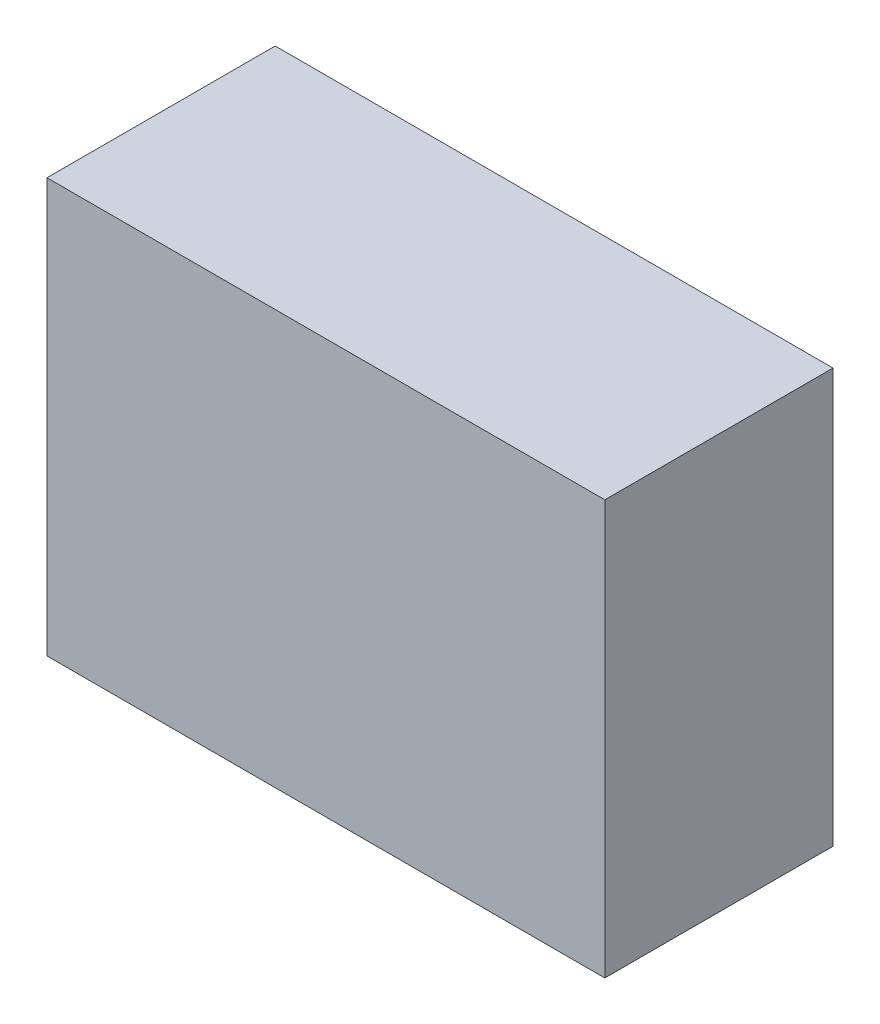
ISO-10303-21;
HEADER;
FILE_DESCRIPTION(('STEP AP214'),'2;1');
FILE_NAME('part.step','',(''),(''),'','','');
FILE_SCHEMA(('AUTOMOTIVE_DESIGN { 1 0 10303 214 1 1 1 1 }'));
ENDSEC;
DATA;
#1=APPLICATION_CONTEXT('core data for automotive mechanical design processes');
#2=APPLICATION_PROTOCOL_DEFINITION('international standard','automotive_design',2000,#1);
#3=PRODUCT_CONTEXT('',#1,'mechanical');
#4=PRODUCT('Part','Part','',(#3));
#5=PRODUCT_RELATED_PRODUCT_CATEGORY('part','',(#4));
#6=PRODUCT_DEFINITION_FORMATION('','',#4);
#7=PRODUCT_DEFINITION_CONTEXT('part definition',#1,'design');
#8=PRODUCT_DEFINITION('design','',#6,#7);
#9=PRODUCT_DEFINITION_SHAPE('','',#8);
#10=(LENGTH_UNIT() NAMED_UNIT(*) SI_UNIT(.MILLI.,.METRE.));
#11=(NAMED_UNIT(*) PLANE_ANGLE_UNIT() SI_UNIT($,.RADIAN.));
#12=(NAMED_UNIT(*) SI_UNIT($,.STERADIAN.) SOLID_ANGLE_UNIT());
#13=UNCERTAINTY_MEASURE_WITH_UNIT(LENGTH_MEASURE(1.E-05),#10,'distance_accuracy_value','');
#14=(GEOMETRIC_REPRESENTATION_CONTEXT(3) GLOBAL_UNCERTAINTY_ASSIGNED_CONTEXT((#13)) GLOBAL_UNIT_ASSIGNED_CONTEXT((#10,
#11,#12)) REPRESENTATION_CONTEXT('',''));
#15=CARTESIAN_POINT('',(0.,0.,0.));
#16=DIRECTION('',(0.,0.,1.));
#17=DIRECTION('',(1.,0.,0.));
#18=AXIS2_PLACEMENT_3D('',#15,#16,#17);
#19=CARTESIAN_POINT('',(33.,-24.5,27.));
#20=DIRECTION('',(-1.,0.,0.));
#21=DIRECTION('',(0.,0.,1.));
#22=AXIS2_PLACEMENT_3D('',#19,#20,#21);
#23=PLANE('',#22);
#24=DIRECTION('',(0.,1.,0.));
#25=VECTOR('',#24,1.);
#26=CARTESIAN_POINT('',(33.,-24.5,0.));
#27=LINE('',#26,#25);
#28=CARTESIAN_POINT('',(33.,-24.5,0.));
#29=VERTEX_POINT('',#28);
#30=CARTESIAN_POINT('',(33.,24.5,0.));
#31=VERTEX_POINT('',#30);
#32=EDGE_CURVE('E102',#29,#31,#27,.T.);
#33=ORIENTED_EDGE('',*,*,#32,.T.);
#34=DIRECTION('',(0.,0.,-1.));
#35=VECTOR('',#34,1.);
#36=CARTESIAN_POINT('',(33.,24.5,27.));
#37=LINE('',#36,#35);
#38=CARTESIAN_POINT('',(33.,24.5,27.));
#39=VERTEX_POINT('',#38);
#40=EDGE_CURVE('E11',#39,#31,#37,.T.);
#41=ORIENTED_EDGE('',*,*,#40,.F.);
#42=DIRECTION('',(0.,1.,0.));
#43=VECTOR('',#42,1.);
#44=CARTESIAN_POINT('',(33.,-24.5,27.));
#45=LINE('',#44,#43);
#46=CARTESIAN_POINT('',(33.,-24.5,27.));
#47=VERTEX_POINT('',#46);
#48=EDGE_CURVE('E90',#47,#39,#45,.T.);
#49=ORIENTED_EDGE('',*,*,#48,.F.);
#50=DIRECTION('',(0.,0.,-1.));
#51=VECTOR('',#50,1.);
#52=CARTESIAN_POINT('',(33.,-24.5,27.));
#53=LINE('',#52,#51);
#54=EDGE_CURVE('E98',#47,#29,#53,.T.);
#55=ORIENTED_EDGE('',*,*,#54,.T.);
#56=EDGE_LOOP('',(#33,#41,#49,#55));
#57=FACE_BOUND('',#56,.T.);
#58=ADVANCED_FACE('F39',(#57),#23,.F.);
#59=CARTESIAN_POINT('',(-33.,24.5,27.));
#60=DIRECTION('',(0.,-1.,0.));
#61=DIRECTION('',(0.,0.,-1.));
#62=AXIS2_PLACEMENT_3D('',#59,#60,#61);
#63=PLANE('',#62);
#64=DIRECTION('',(-1.,0.,0.));
#65=VECTOR('',#64,1.);
#66=CARTESIAN_POINT('',(-33.,24.5,0.));
#67=LINE('',#66,#65);
#68=CARTESIAN_POINT('',(-33.,24.5,0.));
#69=VERTEX_POINT('',#68);
#70=EDGE_CURVE('E94',#31,#69,#67,.T.);
#71=ORIENTED_EDGE('',*,*,#70,.T.);
#72=DIRECTION('',(0.,0.,-1.));
#73=VECTOR('',#72,1.);
#74=CARTESIAN_POINT('',(-33.,24.5,27.));
#75=LINE('',#74,#73);
#76=CARTESIAN_POINT('',(-33.,24.5,27.));
#77=VERTEX_POINT('',#76);
#78=EDGE_CURVE('E47',#77,#69,#75,.T.);
#79=ORIENTED_EDGE('',*,*,#78,.F.);
#80=DIRECTION('',(-1.,0.,0.));
#81=VECTOR('',#80,1.);
#82=CARTESIAN_POINT('',(-33.,24.5,27.));
#83=LINE('',#82,#81);
#84=EDGE_CURVE('E85',#39,#77,#83,.T.);
#85=ORIENTED_EDGE('',*,*,#84,.F.);
#86=ORIENTED_EDGE('',*,*,#40,.T.);
#87=EDGE_LOOP('',(#71,#79,#85,#86));
#88=FACE_BOUND('',#87,.T.);
#89=ADVANCED_FACE('F93',(#88),#63,.F.);
#90=CARTESIAN_POINT('',(-33.,-24.5,27.));
#91=DIRECTION('',(1.,0.,0.));
#92=DIRECTION('',(0.,0.,-1.));
#93=AXIS2_PLACEMENT_3D('',#90,#91,#92);
#94=PLANE('',#93);
#95=DIRECTION('',(0.,-1.,0.));
#96=VECTOR('',#95,1.);
#97=CARTESIAN_POINT('',(-33.,-24.5,0.));
#98=LINE('',#97,#96);
#99=CARTESIAN_POINT('',(-33.,-24.5,0.));
#100=VERTEX_POINT('',#99);
#101=EDGE_CURVE('E72',#69,#100,#98,.T.);
#102=ORIENTED_EDGE('',*,*,#101,.T.);
#103=DIRECTION('',(0.,0.,-1.));
#104=VECTOR('',#103,1.);
#105=CARTESIAN_POINT('',(-33.,-24.5,27.));
#106=LINE('',#105,#104);
#107=CARTESIAN_POINT('',(-33.,-24.5,27.));
#108=VERTEX_POINT('',#107);
#109=EDGE_CURVE('E95',#108,#100,#106,.T.);
#110=ORIENTED_EDGE('',*,*,#109,.F.);
#111=DIRECTION('',(0.,-1.,0.));
#112=VECTOR('',#111,1.);
#113=CARTESIAN_POINT('',(-33.,-24.5,27.));
#114=LINE('',#113,#112);
#115=EDGE_CURVE('E88',#77,#108,#114,.T.);
#116=ORIENTED_EDGE('',*,*,#115,.F.);
#117=ORIENTED_EDGE('',*,*,#78,.T.);
#118=EDGE_LOOP('',(#102,#110,#116,#117));
#119=FACE_BOUND('',#118,.T.);
#120=ADVANCED_FACE('F96',(#119),#94,.F.);
#121=CARTESIAN_POINT('',(-33.,-24.5,27.));
#122=DIRECTION('',(0.,1.,0.));
#123=DIRECTION('',(0.,0.,1.));
#124=AXIS2_PLACEMENT_3D('',#121,#122,#123);
#125=PLANE('',#124);
#126=DIRECTION('',(1.,0.,0.));
#127=VECTOR('',#126,1.);
#128=CARTESIAN_POINT('',(-33.,-24.5,0.));
#129=LINE('',#128,#127);
#130=EDGE_CURVE('E78',#100,#29,#129,.T.);
#131=ORIENTED_EDGE('',*,*,#130,.T.);
#132=ORIENTED_EDGE('',*,*,#54,.F.);
#133=DIRECTION('',(1.,0.,0.));
#134=VECTOR('',#133,1.);
#135=CARTESIAN_POINT('',(-33.,-24.5,27.));
#136=LINE('',#135,#134);
#137=EDGE_CURVE('E55',#108,#47,#136,.T.);
#138=ORIENTED_EDGE('',*,*,#137,.F.);
#139=ORIENTED_EDGE('',*,*,#109,.T.);
#140=EDGE_LOOP('',(#131,#132,#138,#139));
#141=FACE_BOUND('',#140,.T.);
#142=ADVANCED_FACE('F109',(#141),#125,.F.);
#143=CARTESIAN_POINT('',(0.,0.,27.));
#144=DIRECTION('',(0.,0.,-1.));
#145=DIRECTION('',(-1.,0.,0.));
#146=AXIS2_PLACEMENT_3D('',#143,#144,#145);
#147=PLANE('',#146);
#148=ORIENTED_EDGE('',*,*,#48,.T.);
#149=ORIENTED_EDGE('',*,*,#84,.T.);
#150=ORIENTED_EDGE('',*,*,#115,.T.);
#151=ORIENTED_EDGE('',*,*,#137,.T.);
#152=EDGE_LOOP('',(#148,#149,#150,#151));
#153=FACE_BOUND('',#152,.T.);
#154=ADVANCED_FACE('F86',(#153),#147,.F.);
#155=CARTESIAN_POINT('',(0.,0.,0.));
#156=DIRECTION('',(0.,0.,-1.));
#157=DIRECTION('',(-1.,0.,0.));
#158=AXIS2_PLACEMENT_3D('',#155,#156,#157);
#159=PLANE('',#158);
#160=ORIENTED_EDGE('',*,*,#32,.F.);
#161=ORIENTED_EDGE('',*,*,#130,.F.);
#162=ORIENTED_EDGE('',*,*,#101,.F.);
#163=ORIENTED_EDGE('',*,*,#70,.F.);
#164=EDGE_LOOP('',(#160,#161,#162,#163));
#165=FACE_BOUND('',#164,.T.);
#166=ADVANCED_FACE('F112',(#165),#159,.T.);
#167=CLOSED_SHELL('',(#58,#89,#120,#142,#154,#166));
#168=MANIFOLD_SOLID_BREP('B2',#167);
#169=ADVANCED_BREP_SHAPE_REPRESENTATION('',(#18,#168),#14);
#170=SHAPE_DEFINITION_REPRESENTATION(#9,#169);
ENDSEC;
END-ISO-10303-21;
